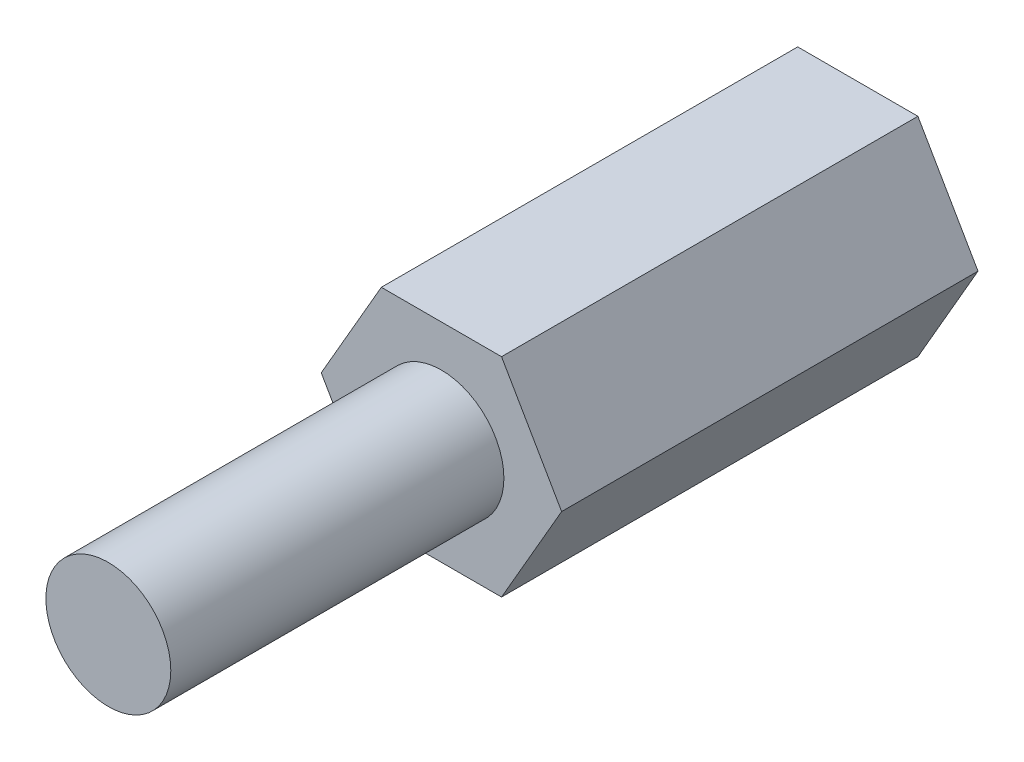
ISO-10303-21;
HEADER;
FILE_DESCRIPTION(('STEP AP214'),'2;1');
FILE_NAME('part.step','',(''),(''),'','','');
FILE_SCHEMA(('AUTOMOTIVE_DESIGN { 1 0 10303 214 1 1 1 1 }'));
ENDSEC;
DATA;
#1=APPLICATION_CONTEXT('core data for automotive mechanical design processes');
#2=APPLICATION_PROTOCOL_DEFINITION('international standard','automotive_design',2000,#1);
#3=PRODUCT_CONTEXT('',#1,'mechanical');
#4=PRODUCT('Part','Part','',(#3));
#5=PRODUCT_RELATED_PRODUCT_CATEGORY('part','',(#4));
#6=PRODUCT_DEFINITION_FORMATION('','',#4);
#7=PRODUCT_DEFINITION_CONTEXT('part definition',#1,'design');
#8=PRODUCT_DEFINITION('design','',#6,#7);
#9=PRODUCT_DEFINITION_SHAPE('','',#8);
#10=(LENGTH_UNIT() NAMED_UNIT(*) SI_UNIT(.MILLI.,.METRE.));
#11=(NAMED_UNIT(*) PLANE_ANGLE_UNIT() SI_UNIT($,.RADIAN.));
#12=(NAMED_UNIT(*) SI_UNIT($,.STERADIAN.) SOLID_ANGLE_UNIT());
#13=UNCERTAINTY_MEASURE_WITH_UNIT(LENGTH_MEASURE(1.E-05),#10,'distance_accuracy_value','');
#14=(GEOMETRIC_REPRESENTATION_CONTEXT(3) GLOBAL_UNCERTAINTY_ASSIGNED_CONTEXT((#13)) GLOBAL_UNIT_ASSIGNED_CONTEXT((#10,
#11,#12)) REPRESENTATION_CONTEXT('',''));
#15=CARTESIAN_POINT('',(0.,0.,0.));
#16=DIRECTION('',(0.,0.,1.));
#17=DIRECTION('',(1.,0.,0.));
#18=AXIS2_PLACEMENT_3D('',#15,#16,#17);
#19=CARTESIAN_POINT('',(1.44337567297409,-2.49999999999999,10.));
#20=DIRECTION('',(-0.866025403784442,0.499999999999995,0.));
#21=DIRECTION('',(-0.499999999999995,-0.866025403784442,0.));
#22=AXIS2_PLACEMENT_3D('',#19,#20,#21);
#23=PLANE('',#22);
#24=DIRECTION('',(0.499999999999995,0.866025403784442,0.));
#25=VECTOR('',#24,1.);
#26=CARTESIAN_POINT('',(1.44337567297409,-2.49999999999999,0.));
#27=LINE('',#26,#25);
#28=CARTESIAN_POINT('',(1.44337567297409,-2.49999999999999,0.));
#29=VERTEX_POINT('',#28);
#30=CARTESIAN_POINT('',(2.88675134594813,0.,0.));
#31=VERTEX_POINT('',#30);
#32=EDGE_CURVE('E120',#29,#31,#27,.T.);
#33=ORIENTED_EDGE('',*,*,#32,.T.);
#34=DIRECTION('',(0.,0.,-1.));
#35=VECTOR('',#34,1.);
#36=CARTESIAN_POINT('',(2.88675134594813,0.,10.));
#37=LINE('',#36,#35);
#38=CARTESIAN_POINT('',(2.88675134594813,0.,10.));
#39=VERTEX_POINT('',#38);
#40=EDGE_CURVE('E37',#39,#31,#37,.T.);
#41=ORIENTED_EDGE('',*,*,#40,.F.);
#42=DIRECTION('',(0.499999999999995,0.866025403784442,0.));
#43=VECTOR('',#42,1.);
#44=CARTESIAN_POINT('',(1.44337567297409,-2.49999999999999,10.));
#45=LINE('',#44,#43);
#46=CARTESIAN_POINT('',(1.44337567297409,-2.49999999999999,10.));
#47=VERTEX_POINT('',#46);
#48=EDGE_CURVE('E131',#47,#39,#45,.T.);
#49=ORIENTED_EDGE('',*,*,#48,.F.);
#50=DIRECTION('',(0.,0.,-1.));
#51=VECTOR('',#50,1.);
#52=CARTESIAN_POINT('',(1.44337567297409,-2.49999999999999,10.));
#53=LINE('',#52,#51);
#54=EDGE_CURVE('E116',#47,#29,#53,.T.);
#55=ORIENTED_EDGE('',*,*,#54,.T.);
#56=EDGE_LOOP('',(#33,#41,#49,#55));
#57=FACE_BOUND('',#56,.T.);
#58=ADVANCED_FACE('F34',(#57),#23,.F.);
#59=CARTESIAN_POINT('',(2.88675134594813,0.,10.));
#60=DIRECTION('',(-0.866025403784438,-0.500000000000001,0.));
#61=DIRECTION('',(0.500000000000001,-0.866025403784438,0.));
#62=AXIS2_PLACEMENT_3D('',#59,#60,#61);
#63=PLANE('',#62);
#64=DIRECTION('',(-0.500000000000001,0.866025403784438,0.));
#65=VECTOR('',#64,1.);
#66=CARTESIAN_POINT('',(2.88675134594813,0.,0.));
#67=LINE('',#66,#65);
#68=CARTESIAN_POINT('',(1.44337567297406,2.50000000000001,0.));
#69=VERTEX_POINT('',#68);
#70=EDGE_CURVE('E123',#31,#69,#67,.T.);
#71=ORIENTED_EDGE('',*,*,#70,.T.);
#72=DIRECTION('',(0.,0.,-1.));
#73=VECTOR('',#72,1.);
#74=CARTESIAN_POINT('',(1.44337567297406,2.50000000000001,10.));
#75=LINE('',#74,#73);
#76=CARTESIAN_POINT('',(1.44337567297406,2.50000000000001,10.));
#77=VERTEX_POINT('',#76);
#78=EDGE_CURVE('E134',#77,#69,#75,.T.);
#79=ORIENTED_EDGE('',*,*,#78,.F.);
#80=DIRECTION('',(-0.500000000000001,0.866025403784438,0.));
#81=VECTOR('',#80,1.);
#82=CARTESIAN_POINT('',(2.88675134594813,0.,10.));
#83=LINE('',#82,#81);
#84=EDGE_CURVE('E89',#39,#77,#83,.T.);
#85=ORIENTED_EDGE('',*,*,#84,.F.);
#86=ORIENTED_EDGE('',*,*,#40,.T.);
#87=EDGE_LOOP('',(#71,#79,#85,#86));
#88=FACE_BOUND('',#87,.T.);
#89=ADVANCED_FACE('F139',(#88),#63,.F.);
#90=CARTESIAN_POINT('',(1.44337567297406,2.50000000000001,10.));
#91=DIRECTION('',(0.,-1.,0.));
#92=DIRECTION('',(1.,0.,0.));
#93=AXIS2_PLACEMENT_3D('',#90,#91,#92);
#94=PLANE('',#93);
#95=DIRECTION('',(-1.,0.,0.));
#96=VECTOR('',#95,1.);
#97=CARTESIAN_POINT('',(1.44337567297406,2.50000000000001,0.));
#98=LINE('',#97,#96);
#99=CARTESIAN_POINT('',(-1.44337567297408,2.5,0.));
#100=VERTEX_POINT('',#99);
#101=EDGE_CURVE('E126',#69,#100,#98,.T.);
#102=ORIENTED_EDGE('',*,*,#101,.T.);
#103=DIRECTION('',(0.,0.,-1.));
#104=VECTOR('',#103,1.);
#105=CARTESIAN_POINT('',(-1.44337567297408,2.5,10.));
#106=LINE('',#105,#104);
#107=CARTESIAN_POINT('',(-1.44337567297408,2.5,10.));
#108=VERTEX_POINT('',#107);
#109=EDGE_CURVE('E111',#108,#100,#106,.T.);
#110=ORIENTED_EDGE('',*,*,#109,.F.);
#111=DIRECTION('',(-1.,0.,0.));
#112=VECTOR('',#111,1.);
#113=CARTESIAN_POINT('',(1.44337567297406,2.50000000000001,10.));
#114=LINE('',#113,#112);
#115=EDGE_CURVE('E102',#77,#108,#114,.T.);
#116=ORIENTED_EDGE('',*,*,#115,.F.);
#117=ORIENTED_EDGE('',*,*,#78,.T.);
#118=EDGE_LOOP('',(#102,#110,#116,#117));
#119=FACE_BOUND('',#118,.T.);
#120=ADVANCED_FACE('F145',(#119),#94,.F.);
#121=CARTESIAN_POINT('',(-1.44337567297408,2.5,10.));
#122=DIRECTION('',(0.866025403784442,-0.499999999999995,0.));
#123=DIRECTION('',(0.499999999999995,0.866025403784442,0.));
#124=AXIS2_PLACEMENT_3D('',#121,#122,#123);
#125=PLANE('',#124);
#126=DIRECTION('',(-0.499999999999995,-0.866025403784442,0.));
#127=VECTOR('',#126,1.);
#128=CARTESIAN_POINT('',(-1.44337567297408,2.5,0.));
#129=LINE('',#128,#127);
#130=CARTESIAN_POINT('',(-2.88675134594813,0.,0.));
#131=VERTEX_POINT('',#130);
#132=EDGE_CURVE('E110',#100,#131,#129,.T.);
#133=ORIENTED_EDGE('',*,*,#132,.T.);
#134=DIRECTION('',(0.,0.,-1.));
#135=VECTOR('',#134,1.);
#136=CARTESIAN_POINT('',(-2.88675134594813,0.,10.));
#137=LINE('',#136,#135);
#138=CARTESIAN_POINT('',(-2.88675134594813,0.,10.));
#139=VERTEX_POINT('',#138);
#140=EDGE_CURVE('E107',#139,#131,#137,.T.);
#141=ORIENTED_EDGE('',*,*,#140,.F.);
#142=DIRECTION('',(-0.499999999999995,-0.866025403784442,0.));
#143=VECTOR('',#142,1.);
#144=CARTESIAN_POINT('',(-1.44337567297408,2.5,10.));
#145=LINE('',#144,#143);
#146=EDGE_CURVE('E96',#108,#139,#145,.T.);
#147=ORIENTED_EDGE('',*,*,#146,.F.);
#148=ORIENTED_EDGE('',*,*,#109,.T.);
#149=EDGE_LOOP('',(#133,#141,#147,#148));
#150=FACE_BOUND('',#149,.T.);
#151=ADVANCED_FACE('F108',(#150),#125,.F.);
#152=CARTESIAN_POINT('',(-2.88675134594813,0.,10.));
#153=DIRECTION('',(0.866025403784435,0.500000000000007,0.));
#154=DIRECTION('',(-0.500000000000007,0.866025403784435,0.));
#155=AXIS2_PLACEMENT_3D('',#152,#153,#154);
#156=PLANE('',#155);
#157=DIRECTION('',(0.500000000000007,-0.866025403784435,0.));
#158=VECTOR('',#157,1.);
#159=CARTESIAN_POINT('',(-2.88675134594813,0.,0.));
#160=LINE('',#159,#158);
#161=CARTESIAN_POINT('',(-1.44337567297404,-2.50000000000002,0.));
#162=VERTEX_POINT('',#161);
#163=EDGE_CURVE('E74',#131,#162,#160,.T.);
#164=ORIENTED_EDGE('',*,*,#163,.T.);
#165=DIRECTION('',(0.,0.,-1.));
#166=VECTOR('',#165,1.);
#167=CARTESIAN_POINT('',(-1.44337567297404,-2.50000000000002,10.));
#168=LINE('',#167,#166);
#169=CARTESIAN_POINT('',(-1.44337567297404,-2.50000000000002,10.));
#170=VERTEX_POINT('',#169);
#171=EDGE_CURVE('E112',#170,#162,#168,.T.);
#172=ORIENTED_EDGE('',*,*,#171,.F.);
#173=DIRECTION('',(0.500000000000007,-0.866025403784435,0.));
#174=VECTOR('',#173,1.);
#175=CARTESIAN_POINT('',(-2.88675134594813,0.,10.));
#176=LINE('',#175,#174);
#177=EDGE_CURVE('E100',#139,#170,#176,.T.);
#178=ORIENTED_EDGE('',*,*,#177,.F.);
#179=ORIENTED_EDGE('',*,*,#140,.T.);
#180=EDGE_LOOP('',(#164,#172,#178,#179));
#181=FACE_BOUND('',#180,.T.);
#182=ADVANCED_FACE('F114',(#181),#156,.F.);
#183=CARTESIAN_POINT('',(-1.44337567297404,-2.50000000000002,10.));
#184=DIRECTION('',(0.,1.,0.));
#185=DIRECTION('',(-1.,0.,0.));
#186=AXIS2_PLACEMENT_3D('',#183,#184,#185);
#187=PLANE('',#186);
#188=DIRECTION('',(1.,0.,0.));
#189=VECTOR('',#188,1.);
#190=CARTESIAN_POINT('',(-1.44337567297404,-2.50000000000002,0.));
#191=LINE('',#190,#189);
#192=EDGE_CURVE('E80',#162,#29,#191,.T.);
#193=ORIENTED_EDGE('',*,*,#192,.T.);
#194=ORIENTED_EDGE('',*,*,#54,.F.);
#195=DIRECTION('',(1.,0.,0.));
#196=VECTOR('',#195,1.);
#197=CARTESIAN_POINT('',(-1.44337567297404,-2.50000000000002,10.));
#198=LINE('',#197,#196);
#199=EDGE_CURVE('E51',#170,#47,#198,.T.);
#200=ORIENTED_EDGE('',*,*,#199,.F.);
#201=ORIENTED_EDGE('',*,*,#171,.T.);
#202=EDGE_LOOP('',(#193,#194,#200,#201));
#203=FACE_BOUND('',#202,.T.);
#204=ADVANCED_FACE('F176',(#203),#187,.F.);
#205=CARTESIAN_POINT('',(0.,0.,10.));
#206=DIRECTION('',(0.,0.,1.));
#207=DIRECTION('',(1.,0.,0.));
#208=AXIS2_PLACEMENT_3D('',#205,#206,#207);
#209=PLANE('',#208);
#210=CARTESIAN_POINT('',(0.,0.,10.));
#211=DIRECTION('',(0.,0.,1.));
#212=DIRECTION('',(1.,0.,0.));
#213=AXIS2_PLACEMENT_3D('',#210,#211,#212);
#214=CIRCLE('',#213,1.5);
#215=CARTESIAN_POINT('',(1.5,0.,10.));
#216=VERTEX_POINT('',#215);
#217=EDGE_CURVE('E11',#216,#216,#214,.T.);
#218=ORIENTED_EDGE('',*,*,#217,.F.);
#219=EDGE_LOOP('',(#218));
#220=FACE_BOUND('',#219,.T.);
#221=ORIENTED_EDGE('',*,*,#48,.T.);
#222=ORIENTED_EDGE('',*,*,#84,.T.);
#223=ORIENTED_EDGE('',*,*,#115,.T.);
#224=ORIENTED_EDGE('',*,*,#146,.T.);
#225=ORIENTED_EDGE('',*,*,#177,.T.);
#226=ORIENTED_EDGE('',*,*,#199,.T.);
#227=EDGE_LOOP('',(#221,#222,#223,#224,#225,#226));
#228=FACE_BOUND('',#227,.T.);
#229=ADVANCED_FACE('F98',(#220,#228),#209,.T.);
#230=CARTESIAN_POINT('',(0.,0.,0.));
#231=DIRECTION('',(0.,0.,1.));
#232=DIRECTION('',(1.,0.,0.));
#233=AXIS2_PLACEMENT_3D('',#230,#231,#232);
#234=PLANE('',#233);
#235=CARTESIAN_POINT('',(0.,0.,0.));
#236=DIRECTION('',(0.,0.,-1.));
#237=DIRECTION('',(-1.,0.,0.));
#238=AXIS2_PLACEMENT_3D('',#235,#236,#237);
#239=CIRCLE('',#238,1.5);
#240=CARTESIAN_POINT('',(-1.5,0.,0.));
#241=VERTEX_POINT('',#240);
#242=EDGE_CURVE('E152',#241,#241,#239,.T.);
#243=ORIENTED_EDGE('',*,*,#242,.F.);
#244=EDGE_LOOP('',(#243));
#245=FACE_BOUND('',#244,.T.);
#246=ORIENTED_EDGE('',*,*,#32,.F.);
#247=ORIENTED_EDGE('',*,*,#192,.F.);
#248=ORIENTED_EDGE('',*,*,#163,.F.);
#249=ORIENTED_EDGE('',*,*,#132,.F.);
#250=ORIENTED_EDGE('',*,*,#101,.F.);
#251=ORIENTED_EDGE('',*,*,#70,.F.);
#252=EDGE_LOOP('',(#246,#247,#248,#249,#250,#251));
#253=FACE_BOUND('',#252,.T.);
#254=ADVANCED_FACE('F144',(#245,#253),#234,.F.);
#255=CARTESIAN_POINT('',(0.,0.,18.));
#256=DIRECTION('',(0.,0.,-1.));
#257=DIRECTION('',(-1.,0.,0.));
#258=AXIS2_PLACEMENT_3D('',#255,#256,#257);
#259=CYLINDRICAL_SURFACE('',#258,1.5);
#260=CARTESIAN_POINT('',(0.,0.,18.));
#261=DIRECTION('',(0.,0.,1.));
#262=DIRECTION('',(1.,0.,0.));
#263=AXIS2_PLACEMENT_3D('',#260,#261,#262);
#264=CIRCLE('',#263,1.5);
#265=CARTESIAN_POINT('',(1.5,0.,18.));
#266=VERTEX_POINT('',#265);
#267=EDGE_CURVE('E124',#266,#266,#264,.T.);
#268=ORIENTED_EDGE('',*,*,#267,.F.);
#269=EDGE_LOOP('',(#268));
#270=FACE_BOUND('',#269,.T.);
#271=ORIENTED_EDGE('',*,*,#217,.T.);
#272=EDGE_LOOP('',(#271));
#273=FACE_BOUND('',#272,.T.);
#274=ADVANCED_FACE('F168',(#270,#273),#259,.T.);
#275=CARTESIAN_POINT('',(0.,0.,18.));
#276=DIRECTION('',(0.,0.,1.));
#277=DIRECTION('',(1.,0.,0.));
#278=AXIS2_PLACEMENT_3D('',#275,#276,#277);
#279=PLANE('',#278);
#280=ORIENTED_EDGE('',*,*,#267,.T.);
#281=EDGE_LOOP('',(#280));
#282=FACE_BOUND('',#281,.T.);
#283=ADVANCED_FACE('F163',(#282),#279,.T.);
#284=CARTESIAN_POINT('',(0.,0.,8.));
#285=DIRECTION('',(0.,0.,-1.));
#286=DIRECTION('',(-1.,0.,0.));
#287=AXIS2_PLACEMENT_3D('',#284,#285,#286);
#288=CYLINDRICAL_SURFACE('',#287,1.5);
#289=CARTESIAN_POINT('',(0.,0.,8.));
#290=DIRECTION('',(0.,0.,-1.));
#291=DIRECTION('',(-1.,0.,0.));
#292=AXIS2_PLACEMENT_3D('',#289,#290,#291);
#293=CIRCLE('',#292,1.5);
#294=CARTESIAN_POINT('',(-1.5,0.,8.));
#295=VERTEX_POINT('',#294);
#296=EDGE_CURVE('E151',#295,#295,#293,.T.);
#297=ORIENTED_EDGE('',*,*,#296,.F.);
#298=EDGE_LOOP('',(#297));
#299=FACE_BOUND('',#298,.T.);
#300=ORIENTED_EDGE('',*,*,#242,.T.);
#301=EDGE_LOOP('',(#300));
#302=FACE_BOUND('',#301,.T.);
#303=ADVANCED_FACE('F160',(#299,#302),#288,.F.);
#304=CARTESIAN_POINT('',(0.,0.,8.));
#305=DIRECTION('',(0.,0.,-1.));
#306=DIRECTION('',(-1.,0.,0.));
#307=AXIS2_PLACEMENT_3D('',#304,#305,#306);
#308=PLANE('',#307);
#309=ORIENTED_EDGE('',*,*,#296,.T.);
#310=EDGE_LOOP('',(#309));
#311=FACE_BOUND('',#310,.T.);
#312=ADVANCED_FACE('F158',(#311),#308,.T.);
#313=CLOSED_SHELL('',(#58,#89,#120,#151,#182,#204,#229,#254,#274,#283,#303,#312));
#314=MANIFOLD_SOLID_BREP('B2',#313);
#315=ADVANCED_BREP_SHAPE_REPRESENTATION('',(#18,#314),#14);
#316=SHAPE_DEFINITION_REPRESENTATION(#9,#315);
ENDSEC;
END-ISO-10303-21;
